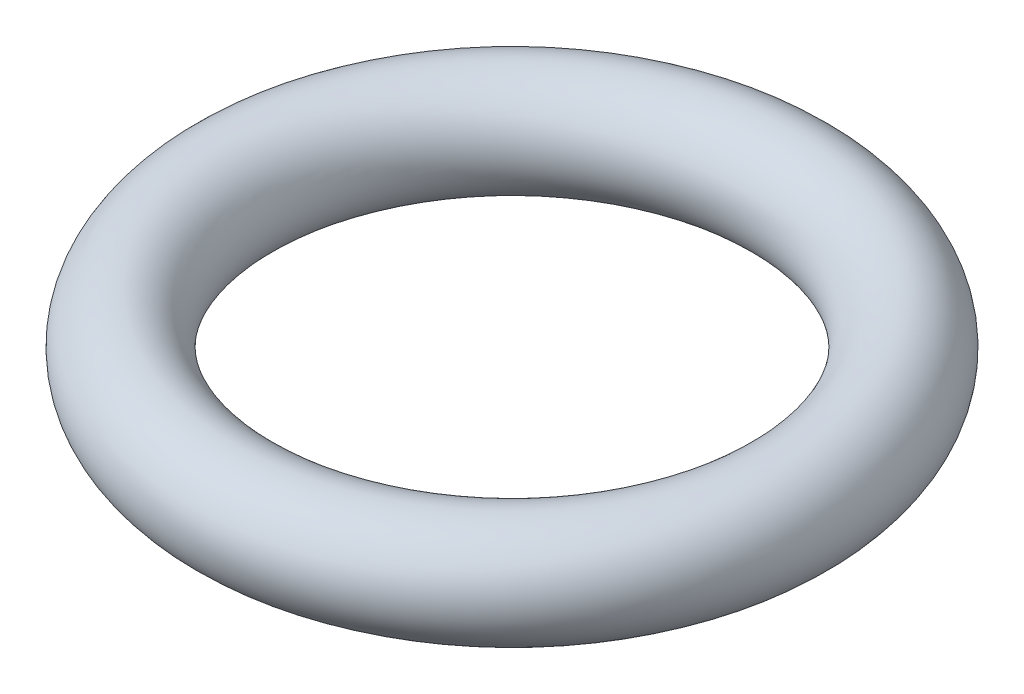
ISO-10303-21;
HEADER;
FILE_DESCRIPTION(('STEP AP214'),'2;1');
FILE_NAME('part.step','',(''),(''),'','','');
FILE_SCHEMA(('AUTOMOTIVE_DESIGN { 1 0 10303 214 1 1 1 1 }'));
ENDSEC;
DATA;
#1=APPLICATION_CONTEXT('core data for automotive mechanical design processes');
#2=APPLICATION_PROTOCOL_DEFINITION('international standard','automotive_design',2000,#1);
#3=PRODUCT_CONTEXT('',#1,'mechanical');
#4=PRODUCT('Part','Part','',(#3));
#5=PRODUCT_RELATED_PRODUCT_CATEGORY('part','',(#4));
#6=PRODUCT_DEFINITION_FORMATION('','',#4);
#7=PRODUCT_DEFINITION_CONTEXT('part definition',#1,'design');
#8=PRODUCT_DEFINITION('design','',#6,#7);
#9=PRODUCT_DEFINITION_SHAPE('','',#8);
#10=(LENGTH_UNIT() NAMED_UNIT(*) SI_UNIT(.MILLI.,.METRE.));
#11=(NAMED_UNIT(*) PLANE_ANGLE_UNIT() SI_UNIT($,.RADIAN.));
#12=(NAMED_UNIT(*) SI_UNIT($,.STERADIAN.) SOLID_ANGLE_UNIT());
#13=UNCERTAINTY_MEASURE_WITH_UNIT(LENGTH_MEASURE(1.E-05),#10,'distance_accuracy_value','');
#14=(GEOMETRIC_REPRESENTATION_CONTEXT(3) GLOBAL_UNCERTAINTY_ASSIGNED_CONTEXT((#13)) GLOBAL_UNIT_ASSIGNED_CONTEXT((#10,
#11,#12)) REPRESENTATION_CONTEXT('',''));
#15=CARTESIAN_POINT('',(0.,0.,0.));
#16=DIRECTION('',(0.,0.,1.));
#17=DIRECTION('',(1.,0.,0.));
#18=AXIS2_PLACEMENT_3D('',#15,#16,#17);
#19=CARTESIAN_POINT('',(0.,0.,0.));
#20=DIRECTION('',(0.,1.,0.));
#21=DIRECTION('',(0.,0.,1.));
#22=AXIS2_PLACEMENT_3D('',#19,#20,#21);
#23=TOROIDAL_SURFACE('',#22,5.25,1.);
#24=CARTESIAN_POINT('',(0.,0.,6.25));
#25=VERTEX_POINT('',#24);
#26=VERTEX_LOOP('',#25);
#27=FACE_BOUND('',#26,.T.);
#28=ADVANCED_FACE('F28',(#27),#23,.T.);
#29=CLOSED_SHELL('',(#28));
#30=MANIFOLD_SOLID_BREP('B2',#29);
#31=ADVANCED_BREP_SHAPE_REPRESENTATION('',(#18,#30),#14);
#32=SHAPE_DEFINITION_REPRESENTATION(#9,#31);
ENDSEC;
END-ISO-10303-21;
